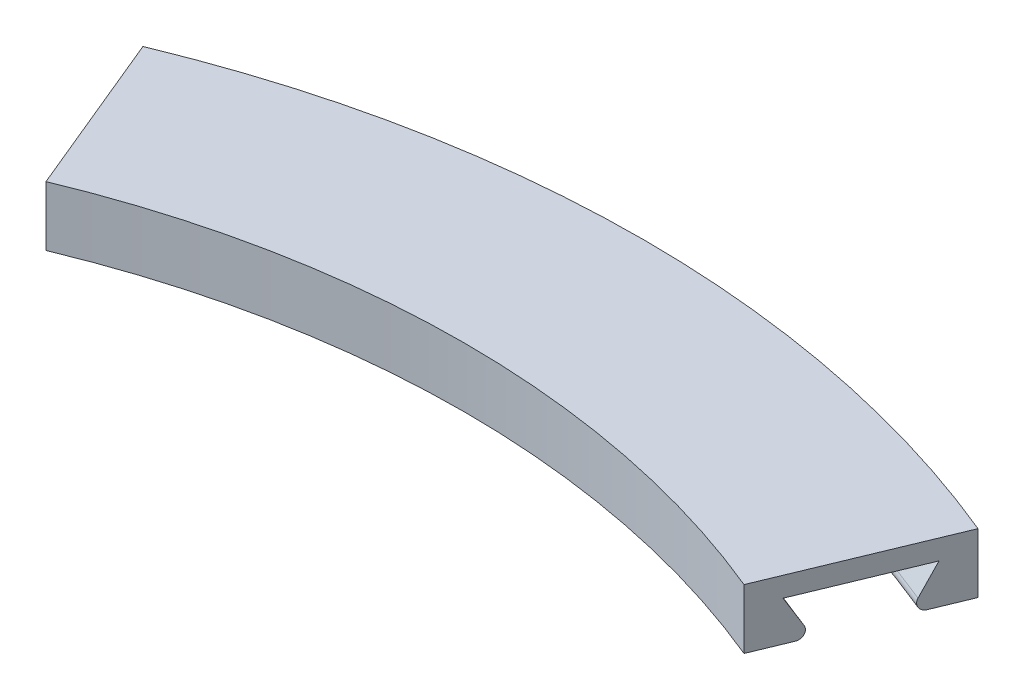
ISO-10303-21;
HEADER;
FILE_DESCRIPTION(('STEP AP214'),'2;1');
FILE_NAME('part.step','',(''),(''),'','','');
FILE_SCHEMA(('AUTOMOTIVE_DESIGN { 1 0 10303 214 1 1 1 1 }'));
ENDSEC;
DATA;
#1=APPLICATION_CONTEXT('core data for automotive mechanical design processes');
#2=APPLICATION_PROTOCOL_DEFINITION('international standard','automotive_design',2000,#1);
#3=PRODUCT_CONTEXT('',#1,'mechanical');
#4=PRODUCT('Part','Part','',(#3));
#5=PRODUCT_RELATED_PRODUCT_CATEGORY('part','',(#4));
#6=PRODUCT_DEFINITION_FORMATION('','',#4);
#7=PRODUCT_DEFINITION_CONTEXT('part definition',#1,'design');
#8=PRODUCT_DEFINITION('design','',#6,#7);
#9=PRODUCT_DEFINITION_SHAPE('','',#8);
#10=(LENGTH_UNIT() NAMED_UNIT(*) SI_UNIT(.MILLI.,.METRE.));
#11=(NAMED_UNIT(*) PLANE_ANGLE_UNIT() SI_UNIT($,.RADIAN.));
#12=(NAMED_UNIT(*) SI_UNIT($,.STERADIAN.) SOLID_ANGLE_UNIT());
#13=UNCERTAINTY_MEASURE_WITH_UNIT(LENGTH_MEASURE(1.E-05),#10,'distance_accuracy_value','');
#14=(GEOMETRIC_REPRESENTATION_CONTEXT(3) GLOBAL_UNCERTAINTY_ASSIGNED_CONTEXT((#13)) GLOBAL_UNIT_ASSIGNED_CONTEXT((#10,
#11,#12)) REPRESENTATION_CONTEXT('',''));
#15=CARTESIAN_POINT('',(0.,0.,0.));
#16=DIRECTION('',(0.,0.,1.));
#17=DIRECTION('',(1.,0.,0.));
#18=AXIS2_PLACEMENT_3D('',#15,#16,#17);
#19=CARTESIAN_POINT('',(0.,6.35,0.));
#20=DIRECTION('',(0.,-1.,0.));
#21=DIRECTION('',(0.,0.,-1.));
#22=AXIS2_PLACEMENT_3D('',#19,#20,#21);
#23=CYLINDRICAL_SURFACE('',#22,174.101233776575);
#24=DIRECTION('',(0.,-1.,0.));
#25=VECTOR('',#24,1.);
#26=CARTESIAN_POINT('',(66.6256577206167,6.35,-160.84856647114));
#27=LINE('',#26,#25);
#28=CARTESIAN_POINT('',(66.6256577206167,6.35,-160.84856647114));
#29=VERTEX_POINT('',#28);
#30=CARTESIAN_POINT('',(66.6256577206167,-3.175,-160.84856647114));
#31=VERTEX_POINT('',#30);
#32=EDGE_CURVE('E121',#29,#31,#27,.T.);
#33=ORIENTED_EDGE('',*,*,#32,.T.);
#34=CARTESIAN_POINT('',(0.,-3.17500000000019,0.));
#35=DIRECTION('',(0.,-1.,0.));
#36=DIRECTION('',(1.,0.,0.));
#37=AXIS2_PLACEMENT_3D('',#34,#35,#36);
#38=CIRCLE('',#37,174.101233776575);
#39=CARTESIAN_POINT('',(-66.6256577206168,-3.17500000000026,-160.84856647114));
#40=VERTEX_POINT('',#39);
#41=EDGE_CURVE('E110',#40,#31,#38,.T.);
#42=ORIENTED_EDGE('',*,*,#41,.F.);
#43=DIRECTION('',(0.,-1.,0.));
#44=VECTOR('',#43,1.);
#45=CARTESIAN_POINT('',(-66.6256577206168,6.35,-160.84856647114));
#46=LINE('',#45,#44);
#47=CARTESIAN_POINT('',(-66.6256577206168,6.35,-160.84856647114));
#48=VERTEX_POINT('',#47);
#49=EDGE_CURVE('E119',#48,#40,#46,.T.);
#50=ORIENTED_EDGE('',*,*,#49,.F.);
#51=CARTESIAN_POINT('',(0.,6.35,0.));
#52=DIRECTION('',(0.,1.,0.));
#53=DIRECTION('',(0.,0.,1.));
#54=AXIS2_PLACEMENT_3D('',#51,#52,#53);
#55=CIRCLE('',#54,174.101233776575);
#56=EDGE_CURVE('E193',#29,#48,#55,.T.);
#57=ORIENTED_EDGE('',*,*,#56,.F.);
#58=EDGE_LOOP('',(#33,#42,#50,#57));
#59=FACE_BOUND('',#58,.T.);
#60=ADVANCED_FACE('F33',(#59),#23,.T.);
#61=CARTESIAN_POINT('',(-66.6256577206168,6.35,-160.84856647114));
#62=DIRECTION('',(0.923879532511286,0.,-0.382683432365091));
#63=DIRECTION('',(-0.382683432365091,0.,-0.923879532511286));
#64=AXIS2_PLACEMENT_3D('',#61,#62,#63);
#65=PLANE('',#64);
#66=DIRECTION('',(0.191341716182543,0.866025403784443,0.461939766255636));
#67=VECTOR('',#66,1.);
#68=CARTESIAN_POINT('',(0.,263.482722706226,-1.06215989438577E-13));
#69=LINE('',#68,#67);
#70=CARTESIAN_POINT('',(-57.5130084874231,3.17499999999977,-138.848685103215));
#71=VERTEX_POINT('',#70);
#72=CARTESIAN_POINT('',(-58.4950973784819,-1.27000000000027,-141.219657423466));
#73=VERTEX_POINT('',#72);
#74=EDGE_CURVE('E181',#71,#73,#69,.F.);
#75=ORIENTED_EDGE('',*,*,#74,.T.);
#76=CARTESIAN_POINT('',(-58.0742021394567,-1.90500000000023,-140.203526429073));
#77=DIRECTION('',(0.923879532511286,0.,-0.382683432365091));
#78=DIRECTION('',(-0.382683432365091,0.,-0.923879532511286));
#79=AXIS2_PLACEMENT_3D('',#76,#77,#78);
#80=CIRCLE('',#79,1.27);
#81=CARTESIAN_POINT('',(-58.0742021394567,-3.17500000000023,-140.203526429073));
#82=VERTEX_POINT('',#81);
#83=EDGE_CURVE('E159',#73,#82,#80,.F.);
#84=ORIENTED_EDGE('',*,*,#83,.T.);
#85=DIRECTION('',(0.382683432365091,0.,0.923879532511286));
#86=VECTOR('',#85,1.);
#87=CARTESIAN_POINT('',(-66.6256577206168,-3.17500000000024,-160.84856647114));
#88=LINE('',#87,#86);
#89=CARTESIAN_POINT('',(-55.6904786407843,-3.17500000000022,-134.44870882963));
#90=VERTEX_POINT('',#89);
#91=EDGE_CURVE('E191',#82,#90,#88,.T.);
#92=ORIENTED_EDGE('',*,*,#91,.T.);
#93=DIRECTION('',(0.,-1.,0.));
#94=VECTOR('',#93,1.);
#95=CARTESIAN_POINT('',(-55.6904786407843,6.35,-134.44870882963));
#96=LINE('',#95,#94);
#97=CARTESIAN_POINT('',(-55.6904786407843,6.35,-134.44870882963));
#98=VERTEX_POINT('',#97);
#99=EDGE_CURVE('E130',#98,#90,#96,.T.);
#100=ORIENTED_EDGE('',*,*,#99,.F.);
#101=DIRECTION('',(0.382683432365091,0.,0.923879532511286));
#102=VECTOR('',#101,1.);
#103=CARTESIAN_POINT('',(-66.6256577206168,6.35,-160.84856647114));
#104=LINE('',#103,#102);
#105=EDGE_CURVE('E127',#48,#98,#104,.T.);
#106=ORIENTED_EDGE('',*,*,#105,.F.);
#107=ORIENTED_EDGE('',*,*,#49,.T.);
#108=DIRECTION('',(0.382683432365091,0.,0.923879532511286));
#109=VECTOR('',#108,1.);
#110=CARTESIAN_POINT('',(-66.6256577206168,-3.17500000000026,-160.84856647114));
#111=LINE('',#110,#109);
#112=CARTESIAN_POINT('',(-64.2419342219444,-3.17500000000026,-155.093748871698));
#113=VERTEX_POINT('',#112);
#114=EDGE_CURVE('E107',#40,#113,#111,.T.);
#115=ORIENTED_EDGE('',*,*,#114,.T.);
#116=CARTESIAN_POINT('',(-64.2419342219445,-1.90500000000026,-155.093748871698));
#117=DIRECTION('',(0.923879532511286,0.,-0.382683432365091));
#118=DIRECTION('',(-0.382683432365091,0.,-0.923879532511286));
#119=AXIS2_PLACEMENT_3D('',#116,#117,#118);
#120=CIRCLE('',#119,1.27);
#121=CARTESIAN_POINT('',(-63.8210389829193,-1.27000000000027,-154.077617877305));
#122=VERTEX_POINT('',#121);
#123=EDGE_CURVE('E48',#113,#122,#120,.F.);
#124=ORIENTED_EDGE('',*,*,#123,.T.);
#125=DIRECTION('',(-0.191341716182543,0.866025403784442,-0.461939766255637));
#126=VECTOR('',#125,1.);
#127=CARTESIAN_POINT('',(0.,-290.128290590413,1.03560589702612E-13));
#128=LINE('',#127,#126);
#129=CARTESIAN_POINT('',(-64.8031278739781,3.17499999999976,-156.448590197555));
#130=VERTEX_POINT('',#129);
#131=EDGE_CURVE('E113',#122,#130,#128,.T.);
#132=ORIENTED_EDGE('',*,*,#131,.T.);
#133=DIRECTION('',(0.382683432365091,0.,0.923879532511286));
#134=VECTOR('',#133,1.);
#135=CARTESIAN_POINT('',(-66.6256577206168,3.17499999999975,-160.84856647114));
#136=LINE('',#135,#134);
#137=EDGE_CURVE('E188',#130,#71,#136,.T.);
#138=ORIENTED_EDGE('',*,*,#137,.T.);
#139=EDGE_LOOP('',(#75,#84,#92,#100,#106,#107,#115,#124,#132,#138));
#140=FACE_BOUND('',#139,.T.);
#141=ADVANCED_FACE('F125',(#140),#65,.F.);
#142=CARTESIAN_POINT('',(0.,6.35,0.));
#143=DIRECTION('',(0.,-1.,0.));
#144=DIRECTION('',(0.,0.,-1.));
#145=AXIS2_PLACEMENT_3D('',#142,#143,#144);
#146=CYLINDRICAL_SURFACE('',#145,145.526233776575);
#147=ORIENTED_EDGE('',*,*,#99,.T.);
#148=CARTESIAN_POINT('',(0.,-3.17500000000016,0.));
#149=DIRECTION('',(0.,-1.,0.));
#150=DIRECTION('',(1.,0.,0.));
#151=AXIS2_PLACEMENT_3D('',#148,#149,#150);
#152=CIRCLE('',#151,145.526233776575);
#153=CARTESIAN_POINT('',(55.6904786407843,-3.1750000000001,-134.44870882963));
#154=VERTEX_POINT('',#153);
#155=EDGE_CURVE('E114',#90,#154,#152,.T.);
#156=ORIENTED_EDGE('',*,*,#155,.T.);
#157=DIRECTION('',(0.,-1.,0.));
#158=VECTOR('',#157,1.);
#159=CARTESIAN_POINT('',(55.6904786407843,6.35,-134.44870882963));
#160=LINE('',#159,#158);
#161=CARTESIAN_POINT('',(55.6904786407843,6.35,-134.44870882963));
#162=VERTEX_POINT('',#161);
#163=EDGE_CURVE('E135',#162,#154,#160,.T.);
#164=ORIENTED_EDGE('',*,*,#163,.F.);
#165=CARTESIAN_POINT('',(0.,6.35,0.));
#166=DIRECTION('',(0.,-1.,0.));
#167=DIRECTION('',(0.,0.,1.));
#168=AXIS2_PLACEMENT_3D('',#165,#166,#167);
#169=CIRCLE('',#168,145.526233776575);
#170=EDGE_CURVE('E196',#98,#162,#169,.T.);
#171=ORIENTED_EDGE('',*,*,#170,.F.);
#172=EDGE_LOOP('',(#147,#156,#164,#171));
#173=FACE_BOUND('',#172,.T.);
#174=ADVANCED_FACE('F205',(#173),#146,.F.);
#175=CARTESIAN_POINT('',(66.6256577206167,6.35,-160.84856647114));
#176=DIRECTION('',(-0.923879532511286,0.,-0.382683432365091));
#177=DIRECTION('',(-0.382683432365091,0.,0.923879532511287));
#178=AXIS2_PLACEMENT_3D('',#175,#176,#177);
#179=PLANE('',#178);
#180=DIRECTION('',(0.382683432365091,0.,-0.923879532511287));
#181=VECTOR('',#180,1.);
#182=CARTESIAN_POINT('',(66.6256577206167,-3.17500000000009,-160.84856647114));
#183=LINE('',#182,#181);
#184=CARTESIAN_POINT('',(58.0742021394566,-3.1750000000001,-140.203526429073));
#185=VERTEX_POINT('',#184);
#186=EDGE_CURVE('E146',#154,#185,#183,.T.);
#187=ORIENTED_EDGE('',*,*,#186,.T.);
#188=CARTESIAN_POINT('',(58.0742021394567,-1.9050000000001,-140.203526429073));
#189=DIRECTION('',(-0.923879532511286,0.,-0.382683432365091));
#190=DIRECTION('',(-0.382683432365091,0.,0.923879532511287));
#191=AXIS2_PLACEMENT_3D('',#188,#189,#190);
#192=CIRCLE('',#191,1.27);
#193=CARTESIAN_POINT('',(58.4950973784819,-1.27000000000033,-141.219657423466));
#194=VERTEX_POINT('',#193);
#195=EDGE_CURVE('E154',#185,#194,#192,.F.);
#196=ORIENTED_EDGE('',*,*,#195,.T.);
#197=DIRECTION('',(0.191341716182543,-0.866025403784443,-0.461939766255637));
#198=VECTOR('',#197,1.);
#199=CARTESIAN_POINT('',(-1.0042296378609E-13,263.482722706226,0.));
#200=LINE('',#199,#198);
#201=CARTESIAN_POINT('',(57.513008487423,3.1749999999999,-138.848685103215));
#202=VERTEX_POINT('',#201);
#203=EDGE_CURVE('E144',#194,#202,#200,.F.);
#204=ORIENTED_EDGE('',*,*,#203,.T.);
#205=DIRECTION('',(0.382683432365091,0.,-0.923879532511287));
#206=VECTOR('',#205,1.);
#207=CARTESIAN_POINT('',(66.6256577206167,3.1749999999999,-160.84856647114));
#208=LINE('',#207,#206);
#209=CARTESIAN_POINT('',(64.803127873978,3.17499999999992,-156.448590197555));
#210=VERTEX_POINT('',#209);
#211=EDGE_CURVE('E141',#202,#210,#208,.T.);
#212=ORIENTED_EDGE('',*,*,#211,.T.);
#213=DIRECTION('',(-0.191341716182543,-0.866025403784443,0.461939766255637));
#214=VECTOR('',#213,1.);
#215=CARTESIAN_POINT('',(0.,-290.128290590413,-1.40736186006114E-13));
#216=LINE('',#215,#214);
#217=CARTESIAN_POINT('',(63.8210389829193,-1.26999999999994,-154.077617877305));
#218=VERTEX_POINT('',#217);
#219=EDGE_CURVE('E132',#210,#218,#216,.T.);
#220=ORIENTED_EDGE('',*,*,#219,.T.);
#221=CARTESIAN_POINT('',(64.2419342219445,-1.90500000000012,-155.093748871698));
#222=DIRECTION('',(-0.923879532511286,0.,-0.382683432365091));
#223=DIRECTION('',(-0.382683432365091,0.,0.923879532511287));
#224=AXIS2_PLACEMENT_3D('',#221,#222,#223);
#225=CIRCLE('',#224,1.27);
#226=CARTESIAN_POINT('',(64.2419342219444,-3.17500000000012,-155.093748871698));
#227=VERTEX_POINT('',#226);
#228=EDGE_CURVE('E152',#218,#227,#225,.F.);
#229=ORIENTED_EDGE('',*,*,#228,.T.);
#230=DIRECTION('',(0.382683432365091,0.,-0.923879532511287));
#231=VECTOR('',#230,1.);
#232=CARTESIAN_POINT('',(66.6256577206167,-3.17500000000011,-160.84856647114));
#233=LINE('',#232,#231);
#234=EDGE_CURVE('E129',#227,#31,#233,.T.);
#235=ORIENTED_EDGE('',*,*,#234,.T.);
#236=ORIENTED_EDGE('',*,*,#32,.F.);
#237=DIRECTION('',(0.382683432365091,0.,-0.923879532511286));
#238=VECTOR('',#237,1.);
#239=CARTESIAN_POINT('',(66.6256577206167,6.35,-160.84856647114));
#240=LINE('',#239,#238);
#241=EDGE_CURVE('E198',#162,#29,#240,.T.);
#242=ORIENTED_EDGE('',*,*,#241,.F.);
#243=ORIENTED_EDGE('',*,*,#163,.T.);
#244=EDGE_LOOP('',(#187,#196,#204,#212,#220,#229,#235,#236,#242,#243));
#245=FACE_BOUND('',#244,.T.);
#246=ADVANCED_FACE('F168',(#245),#179,.F.);
#247=CARTESIAN_POINT('',(0.,6.35,0.));
#248=DIRECTION('',(0.,1.,0.));
#249=DIRECTION('',(0.,0.,1.));
#250=AXIS2_PLACEMENT_3D('',#247,#248,#249);
#251=PLANE('',#250);
#252=ORIENTED_EDGE('',*,*,#56,.T.);
#253=ORIENTED_EDGE('',*,*,#105,.T.);
#254=ORIENTED_EDGE('',*,*,#170,.T.);
#255=ORIENTED_EDGE('',*,*,#241,.T.);
#256=EDGE_LOOP('',(#252,#253,#254,#255));
#257=FACE_BOUND('',#256,.T.);
#258=ADVANCED_FACE('F233',(#257),#251,.T.);
#259=CARTESIAN_POINT('',(145.526233776575,-3.17500000000001,0.));
#260=DIRECTION('',(0.,1.,0.));
#261=DIRECTION('',(-1.,0.,0.));
#262=AXIS2_PLACEMENT_3D('',#259,#260,#261);
#263=PLANE('',#262);
#264=ORIENTED_EDGE('',*,*,#91,.F.);
#265=CARTESIAN_POINT('',(0.,-3.17500000000016,0.));
#266=DIRECTION('',(0.,1.,0.));
#267=DIRECTION('',(-1.,0.,0.));
#268=AXIS2_PLACEMENT_3D('',#265,#266,#267);
#269=CIRCLE('',#268,151.755203460317);
#270=EDGE_CURVE('E149',#82,#185,#269,.F.);
#271=ORIENTED_EDGE('',*,*,#270,.T.);
#272=ORIENTED_EDGE('',*,*,#186,.F.);
#273=ORIENTED_EDGE('',*,*,#155,.F.);
#274=EDGE_LOOP('',(#264,#271,#272,#273));
#275=FACE_BOUND('',#274,.T.);
#276=ADVANCED_FACE('F209',(#275),#263,.F.);
#277=CARTESIAN_POINT('',(0.,3.17499999999983,0.));
#278=DIRECTION('',(0.,-1.,0.));
#279=DIRECTION('',(1.,0.,0.));
#280=AXIS2_PLACEMENT_3D('',#277,#278,#279);
#281=CONICAL_SURFACE('',#280,150.288733776575,0.523598775598291);
#282=ORIENTED_EDGE('',*,*,#203,.F.);
#283=CARTESIAN_POINT('',(0.,-1.27000000000016,0.));
#284=DIRECTION('',(0.,1.,0.));
#285=DIRECTION('',(-1.,0.,0.));
#286=AXIS2_PLACEMENT_3D('',#283,#284,#285);
#287=CIRCLE('',#286,152.855055723123);
#288=EDGE_CURVE('E156',#194,#73,#287,.T.);
#289=ORIENTED_EDGE('',*,*,#288,.T.);
#290=ORIENTED_EDGE('',*,*,#74,.F.);
#291=CARTESIAN_POINT('',(0.,3.17499999999983,0.));
#292=DIRECTION('',(0.,-1.,0.));
#293=DIRECTION('',(1.,0.,0.));
#294=AXIS2_PLACEMENT_3D('',#291,#292,#293);
#295=CIRCLE('',#294,150.288733776575);
#296=EDGE_CURVE('E176',#71,#202,#295,.T.);
#297=ORIENTED_EDGE('',*,*,#296,.T.);
#298=EDGE_LOOP('',(#282,#289,#290,#297));
#299=FACE_BOUND('',#298,.T.);
#300=ADVANCED_FACE('F179',(#299),#281,.T.);
#301=CARTESIAN_POINT('',(150.288733776575,3.17499999999999,0.));
#302=DIRECTION('',(0.,1.,0.));
#303=DIRECTION('',(-1.,0.,0.));
#304=AXIS2_PLACEMENT_3D('',#301,#302,#303);
#305=PLANE('',#304);
#306=CARTESIAN_POINT('',(0.,3.17499999999981,0.));
#307=DIRECTION('',(0.,-1.,0.));
#308=DIRECTION('',(1.,0.,0.));
#309=AXIS2_PLACEMENT_3D('',#306,#307,#308);
#310=CIRCLE('',#309,169.338733776575);
#311=EDGE_CURVE('E122',#130,#210,#310,.T.);
#312=ORIENTED_EDGE('',*,*,#311,.T.);
#313=ORIENTED_EDGE('',*,*,#211,.F.);
#314=ORIENTED_EDGE('',*,*,#296,.F.);
#315=ORIENTED_EDGE('',*,*,#137,.F.);
#316=EDGE_LOOP('',(#312,#313,#314,#315));
#317=FACE_BOUND('',#316,.T.);
#318=ADVANCED_FACE('F174',(#317),#305,.F.);
#319=CARTESIAN_POINT('',(0.,-3.17500000000018,0.));
#320=DIRECTION('',(0.,1.,0.));
#321=DIRECTION('',(-1.,0.,0.));
#322=AXIS2_PLACEMENT_3D('',#319,#320,#321);
#323=CONICAL_SURFACE('',#322,165.672559567221,0.523598775598291);
#324=ORIENTED_EDGE('',*,*,#131,.F.);
#325=CARTESIAN_POINT('',(0.,-1.27000000000022,0.));
#326=DIRECTION('',(0.,-1.,0.));
#327=DIRECTION('',(1.,0.,0.));
#328=AXIS2_PLACEMENT_3D('',#325,#326,#327);
#329=CIRCLE('',#328,166.772411830027);
#330=EDGE_CURVE('E41',#122,#218,#329,.T.);
#331=ORIENTED_EDGE('',*,*,#330,.T.);
#332=ORIENTED_EDGE('',*,*,#219,.F.);
#333=ORIENTED_EDGE('',*,*,#311,.F.);
#334=EDGE_LOOP('',(#324,#331,#332,#333));
#335=FACE_BOUND('',#334,.T.);
#336=ADVANCED_FACE('F163',(#335),#323,.F.);
#337=CARTESIAN_POINT('',(165.672559567221,-3.17500000000001,0.));
#338=DIRECTION('',(0.,1.,0.));
#339=DIRECTION('',(-1.,0.,0.));
#340=AXIS2_PLACEMENT_3D('',#337,#338,#339);
#341=PLANE('',#340);
#342=ORIENTED_EDGE('',*,*,#234,.F.);
#343=CARTESIAN_POINT('',(0.,-3.17500000000019,0.));
#344=DIRECTION('',(0.,1.,0.));
#345=DIRECTION('',(-1.,0.,0.));
#346=AXIS2_PLACEMENT_3D('',#343,#344,#345);
#347=CIRCLE('',#346,167.872264092834);
#348=EDGE_CURVE('E11',#227,#113,#347,.T.);
#349=ORIENTED_EDGE('',*,*,#348,.T.);
#350=ORIENTED_EDGE('',*,*,#114,.F.);
#351=ORIENTED_EDGE('',*,*,#41,.T.);
#352=EDGE_LOOP('',(#342,#349,#350,#351));
#353=FACE_BOUND('',#352,.T.);
#354=ADVANCED_FACE('F109',(#353),#341,.F.);
#355=CARTESIAN_POINT('',(0.,-1.90500000000016,0.));
#356=DIRECTION('',(0.,1.,0.));
#357=DIRECTION('',(-1.,0.,0.));
#358=AXIS2_PLACEMENT_3D('',#355,#356,#357);
#359=TOROIDAL_SURFACE('',#358,151.755203460317,1.27);
#360=ORIENTED_EDGE('',*,*,#83,.F.);
#361=ORIENTED_EDGE('',*,*,#288,.F.);
#362=ORIENTED_EDGE('',*,*,#195,.F.);
#363=ORIENTED_EDGE('',*,*,#270,.F.);
#364=EDGE_LOOP('',(#360,#361,#362,#363));
#365=FACE_BOUND('',#364,.T.);
#366=ADVANCED_FACE('F213',(#365),#359,.T.);
#367=CARTESIAN_POINT('',(0.,-1.90500000000019,0.));
#368=DIRECTION('',(0.,1.,0.));
#369=DIRECTION('',(-1.,0.,0.));
#370=AXIS2_PLACEMENT_3D('',#367,#368,#369);
#371=TOROIDAL_SURFACE('',#370,167.872264092834,1.27);
#372=ORIENTED_EDGE('',*,*,#123,.F.);
#373=ORIENTED_EDGE('',*,*,#348,.F.);
#374=ORIENTED_EDGE('',*,*,#228,.F.);
#375=ORIENTED_EDGE('',*,*,#330,.F.);
#376=EDGE_LOOP('',(#372,#373,#374,#375));
#377=FACE_BOUND('',#376,.T.);
#378=ADVANCED_FACE('F35',(#377),#371,.T.);
#379=CLOSED_SHELL('',(#60,#141,#174,#246,#258,#276,#300,#318,#336,#354,#366,#378));
#380=MANIFOLD_SOLID_BREP('B2',#379);
#381=ADVANCED_BREP_SHAPE_REPRESENTATION('',(#18,#380),#14);
#382=SHAPE_DEFINITION_REPRESENTATION(#9,#381);
ENDSEC;
END-ISO-10303-21;
